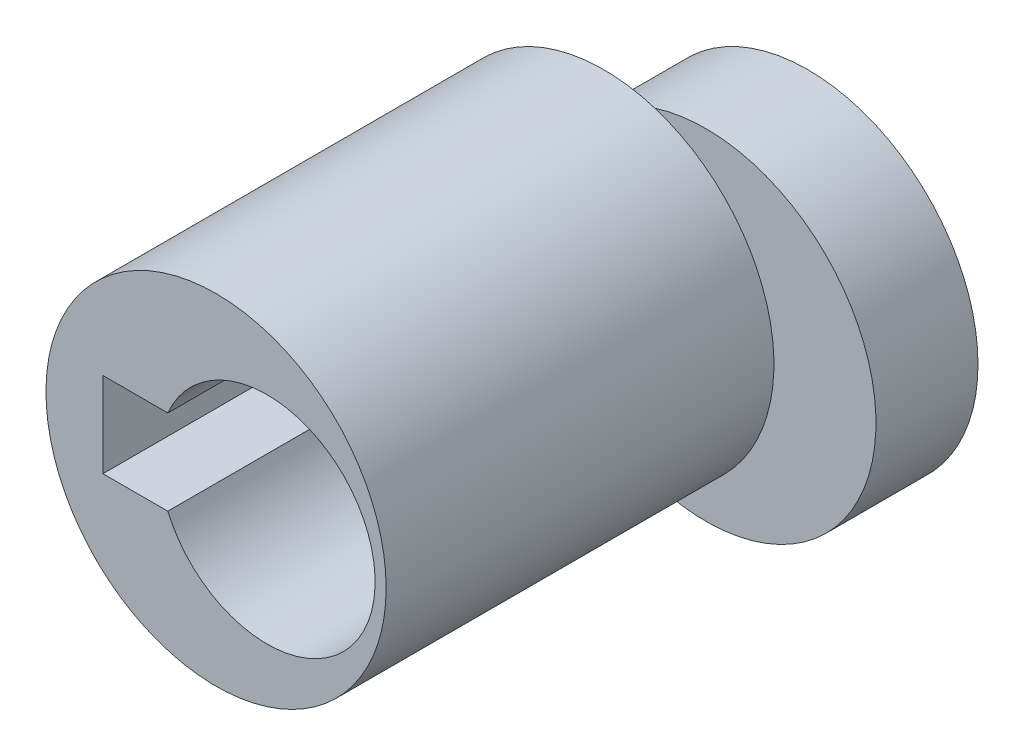
ISO-10303-21;
HEADER;
FILE_DESCRIPTION(('STEP AP214'),'2;1');
FILE_NAME('part.step','',(''),(''),'','','');
FILE_SCHEMA(('AUTOMOTIVE_DESIGN { 1 0 10303 214 1 1 1 1 }'));
ENDSEC;
DATA;
#1=APPLICATION_CONTEXT('core data for automotive mechanical design processes');
#2=APPLICATION_PROTOCOL_DEFINITION('international standard','automotive_design',2000,#1);
#3=PRODUCT_CONTEXT('',#1,'mechanical');
#4=PRODUCT('Part','Part','',(#3));
#5=PRODUCT_RELATED_PRODUCT_CATEGORY('part','',(#4));
#6=PRODUCT_DEFINITION_FORMATION('','',#4);
#7=PRODUCT_DEFINITION_CONTEXT('part definition',#1,'design');
#8=PRODUCT_DEFINITION('design','',#6,#7);
#9=PRODUCT_DEFINITION_SHAPE('','',#8);
#10=(LENGTH_UNIT() NAMED_UNIT(*) SI_UNIT(.MILLI.,.METRE.));
#11=(NAMED_UNIT(*) PLANE_ANGLE_UNIT() SI_UNIT($,.RADIAN.));
#12=(NAMED_UNIT(*) SI_UNIT($,.STERADIAN.) SOLID_ANGLE_UNIT());
#13=UNCERTAINTY_MEASURE_WITH_UNIT(LENGTH_MEASURE(1.E-05),#10,'distance_accuracy_value','');
#14=(GEOMETRIC_REPRESENTATION_CONTEXT(3) GLOBAL_UNCERTAINTY_ASSIGNED_CONTEXT((#13)) GLOBAL_UNIT_ASSIGNED_CONTEXT((#10,
#11,#12)) REPRESENTATION_CONTEXT('',''));
#15=CARTESIAN_POINT('',(0.,0.,0.));
#16=DIRECTION('',(0.,0.,1.));
#17=DIRECTION('',(1.,0.,0.));
#18=AXIS2_PLACEMENT_3D('',#15,#16,#17);
#19=CARTESIAN_POINT('',(0.,0.,6.));
#20=DIRECTION('',(0.,0.,-1.));
#21=DIRECTION('',(-1.,0.,0.));
#22=AXIS2_PLACEMENT_3D('',#19,#20,#21);
#23=CYLINDRICAL_SURFACE('',#22,10.);
#24=CARTESIAN_POINT('',(0.,0.,6.));
#25=DIRECTION('',(0.,0.,1.));
#26=DIRECTION('',(1.,0.,0.));
#27=AXIS2_PLACEMENT_3D('',#24,#25,#26);
#28=CIRCLE('',#27,10.);
#29=CARTESIAN_POINT('',(-3.,9.53939201416946,6.));
#30=VERTEX_POINT('',#29);
#31=CARTESIAN_POINT('',(-3.,-9.53939201416946,6.));
#32=VERTEX_POINT('',#31);
#33=EDGE_CURVE('E48',#30,#32,#28,.T.);
#34=ORIENTED_EDGE('',*,*,#33,.F.);
#35=EDGE_CURVE('E145',#32,#30,#28,.T.);
#36=ORIENTED_EDGE('',*,*,#35,.F.);
#37=EDGE_LOOP('',(#34,#36));
#38=FACE_BOUND('',#37,.T.);
#39=CARTESIAN_POINT('',(0.,0.,0.));
#40=DIRECTION('',(0.,0.,1.));
#41=DIRECTION('',(1.,0.,0.));
#42=AXIS2_PLACEMENT_3D('',#39,#40,#41);
#43=CIRCLE('',#42,10.);
#44=CARTESIAN_POINT('',(10.,0.,0.));
#45=VERTEX_POINT('',#44);
#46=EDGE_CURVE('E42',#45,#45,#43,.T.);
#47=ORIENTED_EDGE('',*,*,#46,.T.);
#48=EDGE_LOOP('',(#47));
#49=FACE_BOUND('',#48,.T.);
#50=ADVANCED_FACE('F39',(#38,#49),#23,.T.);
#51=CARTESIAN_POINT('',(0.,0.,6.));
#52=DIRECTION('',(0.,0.,1.));
#53=DIRECTION('',(1.,0.,0.));
#54=AXIS2_PLACEMENT_3D('',#51,#52,#53);
#55=PLANE('',#54);
#56=CARTESIAN_POINT('',(-6.,0.,6.));
#57=DIRECTION('',(0.,0.,1.));
#58=DIRECTION('',(1.,0.,0.));
#59=AXIS2_PLACEMENT_3D('',#56,#57,#58);
#60=CIRCLE('',#59,10.);
#61=EDGE_CURVE('E11',#32,#30,#60,.T.);
#62=ORIENTED_EDGE('',*,*,#61,.F.);
#63=ORIENTED_EDGE('',*,*,#35,.T.);
#64=EDGE_LOOP('',(#62,#63));
#65=FACE_BOUND('',#64,.T.);
#66=ADVANCED_FACE('F157',(#65),#55,.T.);
#67=CARTESIAN_POINT('',(0.,0.,0.));
#68=DIRECTION('',(0.,0.,1.));
#69=DIRECTION('',(1.,0.,0.));
#70=AXIS2_PLACEMENT_3D('',#67,#68,#69);
#71=PLANE('',#70);
#72=ORIENTED_EDGE('',*,*,#46,.F.);
#73=EDGE_LOOP('',(#72));
#74=FACE_BOUND('',#73,.T.);
#75=ADVANCED_FACE('F154',(#74),#71,.F.);
#76=CARTESIAN_POINT('',(-6.,0.,6.));
#77=DIRECTION('',(0.,0.,1.));
#78=DIRECTION('',(1.,0.,0.));
#79=AXIS2_PLACEMENT_3D('',#76,#77,#78);
#80=PLANE('',#79);
#81=EDGE_CURVE('E50',#30,#32,#60,.T.);
#82=ORIENTED_EDGE('',*,*,#81,.F.);
#83=ORIENTED_EDGE('',*,*,#33,.T.);
#84=EDGE_LOOP('',(#82,#83));
#85=FACE_BOUND('',#84,.T.);
#86=ADVANCED_FACE('F156',(#85),#80,.F.);
#87=CARTESIAN_POINT('',(-6.,0.,28.8));
#88=DIRECTION('',(0.,0.,-1.));
#89=DIRECTION('',(-1.,0.,0.));
#90=AXIS2_PLACEMENT_3D('',#87,#88,#89);
#91=CYLINDRICAL_SURFACE('',#90,10.);
#92=CARTESIAN_POINT('',(-6.,0.,28.8));
#93=DIRECTION('',(0.,0.,1.));
#94=DIRECTION('',(1.,0.,0.));
#95=AXIS2_PLACEMENT_3D('',#92,#93,#94);
#96=CIRCLE('',#95,10.);
#97=CARTESIAN_POINT('',(4.,0.,28.8));
#98=VERTEX_POINT('',#97);
#99=EDGE_CURVE('E138',#98,#98,#96,.T.);
#100=ORIENTED_EDGE('',*,*,#99,.F.);
#101=EDGE_LOOP('',(#100));
#102=FACE_BOUND('',#101,.T.);
#103=ORIENTED_EDGE('',*,*,#81,.T.);
#104=ORIENTED_EDGE('',*,*,#61,.T.);
#105=EDGE_LOOP('',(#103,#104));
#106=FACE_BOUND('',#105,.T.);
#107=ADVANCED_FACE('F162',(#102,#106),#91,.T.);
#108=CARTESIAN_POINT('',(-6.,0.,28.8));
#109=DIRECTION('',(0.,0.,1.));
#110=DIRECTION('',(1.,0.,0.));
#111=AXIS2_PLACEMENT_3D('',#108,#109,#110);
#112=PLANE('',#111);
#113=CARTESIAN_POINT('',(-3.,0.,28.8));
#114=DIRECTION('',(0.,0.,1.));
#115=DIRECTION('',(1.,0.,0.));
#116=AXIS2_PLACEMENT_3D('',#113,#114,#115);
#117=CIRCLE('',#116,6.35);
#118=CARTESIAN_POINT('',(-8.83716540796986,-2.5,28.8));
#119=VERTEX_POINT('',#118);
#120=CARTESIAN_POINT('',(-8.83716540796986,2.5,28.8));
#121=VERTEX_POINT('',#120);
#122=EDGE_CURVE('E57',#119,#121,#117,.T.);
#123=ORIENTED_EDGE('',*,*,#122,.F.);
#124=DIRECTION('',(1.,0.,0.));
#125=VECTOR('',#124,1.);
#126=CARTESIAN_POINT('',(-12.65,-2.5,28.8));
#127=LINE('',#126,#125);
#128=CARTESIAN_POINT('',(-12.65,-2.5,28.8));
#129=VERTEX_POINT('',#128);
#130=EDGE_CURVE('E111',#129,#119,#127,.T.);
#131=ORIENTED_EDGE('',*,*,#130,.F.);
#132=DIRECTION('',(0.,-1.,0.));
#133=VECTOR('',#132,1.);
#134=CARTESIAN_POINT('',(-12.65,2.5,28.8));
#135=LINE('',#134,#133);
#136=CARTESIAN_POINT('',(-12.65,2.5,28.8));
#137=VERTEX_POINT('',#136);
#138=EDGE_CURVE('E115',#137,#129,#135,.T.);
#139=ORIENTED_EDGE('',*,*,#138,.F.);
#140=DIRECTION('',(-1.,0.,0.));
#141=VECTOR('',#140,1.);
#142=CARTESIAN_POINT('',(-12.65,2.5,28.8));
#143=LINE('',#142,#141);
#144=EDGE_CURVE('E124',#121,#137,#143,.T.);
#145=ORIENTED_EDGE('',*,*,#144,.F.);
#146=EDGE_LOOP('',(#123,#131,#139,#145));
#147=FACE_BOUND('',#146,.T.);
#148=ORIENTED_EDGE('',*,*,#99,.T.);
#149=EDGE_LOOP('',(#148));
#150=FACE_BOUND('',#149,.T.);
#151=ADVANCED_FACE('F189',(#147,#150),#112,.T.);
#152=CARTESIAN_POINT('',(-3.,0.,15.8));
#153=DIRECTION('',(0.,0.,1.));
#154=DIRECTION('',(1.,0.,0.));
#155=AXIS2_PLACEMENT_3D('',#152,#153,#154);
#156=CYLINDRICAL_SURFACE('',#155,6.35);
#157=ORIENTED_EDGE('',*,*,#122,.T.);
#158=DIRECTION('',(0.,0.,1.));
#159=VECTOR('',#158,1.);
#160=CARTESIAN_POINT('',(-8.83716540796986,2.5,15.8));
#161=LINE('',#160,#159);
#162=CARTESIAN_POINT('',(-8.83716540796986,2.5,15.8));
#163=VERTEX_POINT('',#162);
#164=EDGE_CURVE('E86',#163,#121,#161,.T.);
#165=ORIENTED_EDGE('',*,*,#164,.F.);
#166=CARTESIAN_POINT('',(-3.,0.,15.8));
#167=DIRECTION('',(0.,0.,1.));
#168=DIRECTION('',(1.,0.,0.));
#169=AXIS2_PLACEMENT_3D('',#166,#167,#168);
#170=CIRCLE('',#169,6.35);
#171=CARTESIAN_POINT('',(-8.83716540796986,-2.5,15.8));
#172=VERTEX_POINT('',#171);
#173=EDGE_CURVE('E90',#172,#163,#170,.T.);
#174=ORIENTED_EDGE('',*,*,#173,.F.);
#175=DIRECTION('',(0.,0.,1.));
#176=VECTOR('',#175,1.);
#177=CARTESIAN_POINT('',(-8.83716540796986,-2.5,15.8));
#178=LINE('',#177,#176);
#179=EDGE_CURVE('E130',#172,#119,#178,.T.);
#180=ORIENTED_EDGE('',*,*,#179,.T.);
#181=EDGE_LOOP('',(#157,#165,#174,#180));
#182=FACE_BOUND('',#181,.T.);
#183=ADVANCED_FACE('F88',(#182),#156,.F.);
#184=CARTESIAN_POINT('',(-12.65,-2.5,15.8));
#185=DIRECTION('',(0.,-1.,0.));
#186=DIRECTION('',(0.,0.,-1.));
#187=AXIS2_PLACEMENT_3D('',#184,#185,#186);
#188=PLANE('',#187);
#189=ORIENTED_EDGE('',*,*,#130,.T.);
#190=ORIENTED_EDGE('',*,*,#179,.F.);
#191=DIRECTION('',(1.,0.,0.));
#192=VECTOR('',#191,1.);
#193=CARTESIAN_POINT('',(-12.65,-2.5,15.8));
#194=LINE('',#193,#192);
#195=CARTESIAN_POINT('',(-12.65,-2.5,15.8));
#196=VERTEX_POINT('',#195);
#197=EDGE_CURVE('E97',#196,#172,#194,.T.);
#198=ORIENTED_EDGE('',*,*,#197,.F.);
#199=DIRECTION('',(0.,0.,1.));
#200=VECTOR('',#199,1.);
#201=CARTESIAN_POINT('',(-12.65,-2.5,15.8));
#202=LINE('',#201,#200);
#203=EDGE_CURVE('E133',#196,#129,#202,.T.);
#204=ORIENTED_EDGE('',*,*,#203,.T.);
#205=EDGE_LOOP('',(#189,#190,#198,#204));
#206=FACE_BOUND('',#205,.T.);
#207=ADVANCED_FACE('F208',(#206),#188,.F.);
#208=CARTESIAN_POINT('',(-12.65,2.5,15.8));
#209=DIRECTION('',(-1.,0.,0.));
#210=DIRECTION('',(0.,0.,1.));
#211=AXIS2_PLACEMENT_3D('',#208,#209,#210);
#212=PLANE('',#211);
#213=ORIENTED_EDGE('',*,*,#138,.T.);
#214=ORIENTED_EDGE('',*,*,#203,.F.);
#215=DIRECTION('',(0.,-1.,0.));
#216=VECTOR('',#215,1.);
#217=CARTESIAN_POINT('',(-12.65,2.5,15.8));
#218=LINE('',#217,#216);
#219=CARTESIAN_POINT('',(-12.65,2.5,15.8));
#220=VERTEX_POINT('',#219);
#221=EDGE_CURVE('E106',#220,#196,#218,.T.);
#222=ORIENTED_EDGE('',*,*,#221,.F.);
#223=DIRECTION('',(0.,0.,1.));
#224=VECTOR('',#223,1.);
#225=CARTESIAN_POINT('',(-12.65,2.5,15.8));
#226=LINE('',#225,#224);
#227=EDGE_CURVE('E96',#220,#137,#226,.T.);
#228=ORIENTED_EDGE('',*,*,#227,.T.);
#229=EDGE_LOOP('',(#213,#214,#222,#228));
#230=FACE_BOUND('',#229,.T.);
#231=ADVANCED_FACE('F217',(#230),#212,.F.);
#232=CARTESIAN_POINT('',(-12.65,2.5,15.8));
#233=DIRECTION('',(0.,1.,0.));
#234=DIRECTION('',(0.,0.,1.));
#235=AXIS2_PLACEMENT_3D('',#232,#233,#234);
#236=PLANE('',#235);
#237=ORIENTED_EDGE('',*,*,#144,.T.);
#238=ORIENTED_EDGE('',*,*,#227,.F.);
#239=DIRECTION('',(-1.,0.,0.));
#240=VECTOR('',#239,1.);
#241=CARTESIAN_POINT('',(-12.65,2.5,15.8));
#242=LINE('',#241,#240);
#243=EDGE_CURVE('E100',#163,#220,#242,.T.);
#244=ORIENTED_EDGE('',*,*,#243,.F.);
#245=ORIENTED_EDGE('',*,*,#164,.T.);
#246=EDGE_LOOP('',(#237,#238,#244,#245));
#247=FACE_BOUND('',#246,.T.);
#248=ADVANCED_FACE('F101',(#247),#236,.F.);
#249=CARTESIAN_POINT('',(-3.,0.,15.8));
#250=DIRECTION('',(0.,0.,1.));
#251=DIRECTION('',(1.,0.,0.));
#252=AXIS2_PLACEMENT_3D('',#249,#250,#251);
#253=PLANE('',#252);
#254=ORIENTED_EDGE('',*,*,#173,.T.);
#255=ORIENTED_EDGE('',*,*,#243,.T.);
#256=ORIENTED_EDGE('',*,*,#221,.T.);
#257=ORIENTED_EDGE('',*,*,#197,.T.);
#258=EDGE_LOOP('',(#254,#255,#256,#257));
#259=FACE_BOUND('',#258,.T.);
#260=ADVANCED_FACE('F108',(#259),#253,.T.);
#261=CLOSED_SHELL('',(#50,#66,#75,#86,#107,#151,#183,#207,#231,#248,#260));
#262=MANIFOLD_SOLID_BREP('B2',#261);
#263=ADVANCED_BREP_SHAPE_REPRESENTATION('',(#18,#262),#14);
#264=SHAPE_DEFINITION_REPRESENTATION(#9,#263);
ENDSEC;
END-ISO-10303-21;
